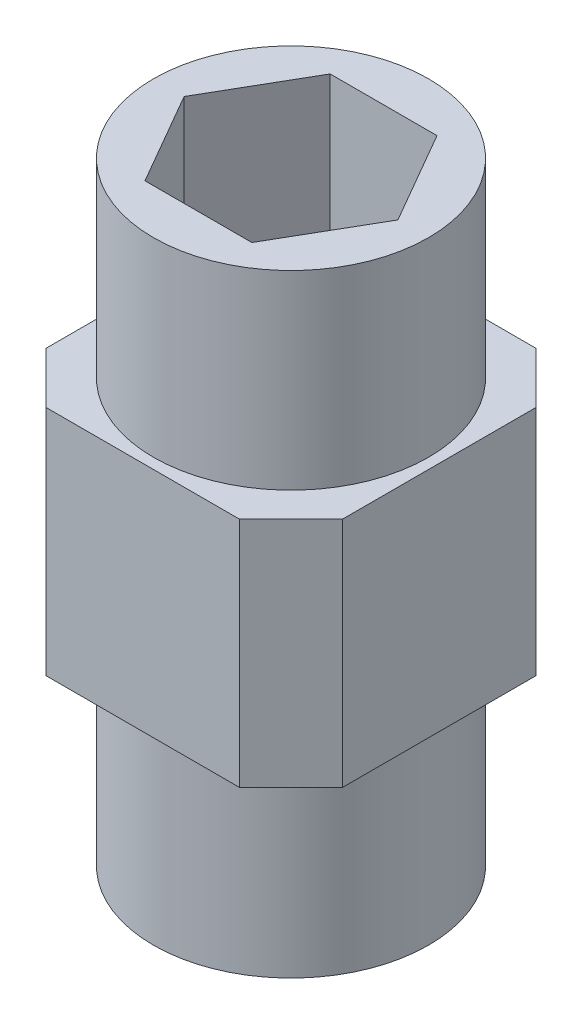
ISO-10303-21;
HEADER;
FILE_DESCRIPTION(('STEP AP214'),'2;1');
FILE_NAME('part.step','',(''),(''),'','','');
FILE_SCHEMA(('AUTOMOTIVE_DESIGN { 1 0 10303 214 1 1 1 1 }'));
ENDSEC;
DATA;
#1=APPLICATION_CONTEXT('core data for automotive mechanical design processes');
#2=APPLICATION_PROTOCOL_DEFINITION('international standard','automotive_design',2000,#1);
#3=PRODUCT_CONTEXT('',#1,'mechanical');
#4=PRODUCT('Part','Part','',(#3));
#5=PRODUCT_RELATED_PRODUCT_CATEGORY('part','',(#4));
#6=PRODUCT_DEFINITION_FORMATION('','',#4);
#7=PRODUCT_DEFINITION_CONTEXT('part definition',#1,'design');
#8=PRODUCT_DEFINITION('design','',#6,#7);
#9=PRODUCT_DEFINITION_SHAPE('','',#8);
#10=(LENGTH_UNIT() NAMED_UNIT(*) SI_UNIT(.MILLI.,.METRE.));
#11=(NAMED_UNIT(*) PLANE_ANGLE_UNIT() SI_UNIT($,.RADIAN.));
#12=(NAMED_UNIT(*) SI_UNIT($,.STERADIAN.) SOLID_ANGLE_UNIT());
#13=UNCERTAINTY_MEASURE_WITH_UNIT(LENGTH_MEASURE(1.E-05),#10,'distance_accuracy_value','');
#14=(GEOMETRIC_REPRESENTATION_CONTEXT(3) GLOBAL_UNCERTAINTY_ASSIGNED_CONTEXT((#13)) GLOBAL_UNIT_ASSIGNED_CONTEXT((#10,
#11,#12)) REPRESENTATION_CONTEXT('',''));
#15=CARTESIAN_POINT('',(0.,0.,0.));
#16=DIRECTION('',(0.,0.,1.));
#17=DIRECTION('',(1.,0.,0.));
#18=AXIS2_PLACEMENT_3D('',#15,#16,#17);
#19=CARTESIAN_POINT('',(0.,13.1,0.));
#20=DIRECTION('',(0.,1.,0.));
#21=DIRECTION('',(0.,0.,1.));
#22=AXIS2_PLACEMENT_3D('',#19,#20,#21);
#23=PLANE('',#22);
#24=CARTESIAN_POINT('',(0.,13.1,0.));
#25=DIRECTION('',(0.,1.,0.));
#26=DIRECTION('',(0.,0.,1.));
#27=AXIS2_PLACEMENT_3D('',#24,#25,#26);
#28=CIRCLE('',#27,9.475);
#29=CARTESIAN_POINT('',(0.,13.1,9.475));
#30=VERTEX_POINT('',#29);
#31=EDGE_CURVE('E11',#30,#30,#28,.T.);
#32=ORIENTED_EDGE('',*,*,#31,.T.);
#33=EDGE_LOOP('',(#32));
#34=FACE_BOUND('',#33,.T.);
#35=DIRECTION('',(-0.5,0.,-0.866025403784438));
#36=VECTOR('',#35,1.);
#37=CARTESIAN_POINT('',(7.36121593216773,13.1,0.));
#38=LINE('',#37,#36);
#39=CARTESIAN_POINT('',(7.36121593216773,13.1,0.));
#40=VERTEX_POINT('',#39);
#41=CARTESIAN_POINT('',(3.68060796608386,13.1,-6.375));
#42=VERTEX_POINT('',#41);
#43=EDGE_CURVE('E281',#40,#42,#38,.T.);
#44=ORIENTED_EDGE('',*,*,#43,.F.);
#45=DIRECTION('',(0.5,0.,-0.866025403784438));
#46=VECTOR('',#45,1.);
#47=CARTESIAN_POINT('',(3.68060796608386,13.1,6.375));
#48=LINE('',#47,#46);
#49=CARTESIAN_POINT('',(3.68060796608386,13.1,6.375));
#50=VERTEX_POINT('',#49);
#51=EDGE_CURVE('E276',#50,#40,#48,.T.);
#52=ORIENTED_EDGE('',*,*,#51,.F.);
#53=DIRECTION('',(1.,0.,0.));
#54=VECTOR('',#53,1.);
#55=CARTESIAN_POINT('',(-3.68060796608386,13.1,6.375));
#56=LINE('',#55,#54);
#57=CARTESIAN_POINT('',(-3.68060796608386,13.1,6.375));
#58=VERTEX_POINT('',#57);
#59=EDGE_CURVE('E69',#58,#50,#56,.T.);
#60=ORIENTED_EDGE('',*,*,#59,.F.);
#61=DIRECTION('',(0.5,0.,0.866025403784438));
#62=VECTOR('',#61,1.);
#63=CARTESIAN_POINT('',(-7.36121593216773,13.1,0.));
#64=LINE('',#63,#62);
#65=CARTESIAN_POINT('',(-7.36121593216773,13.1,0.));
#66=VERTEX_POINT('',#65);
#67=EDGE_CURVE('E292',#66,#58,#64,.T.);
#68=ORIENTED_EDGE('',*,*,#67,.F.);
#69=DIRECTION('',(-0.5,0.,0.866025403784439));
#70=VECTOR('',#69,1.);
#71=CARTESIAN_POINT('',(-3.68060796608386,13.1,-6.375));
#72=LINE('',#71,#70);
#73=CARTESIAN_POINT('',(-3.68060796608386,13.1,-6.375));
#74=VERTEX_POINT('',#73);
#75=EDGE_CURVE('E287',#74,#66,#72,.T.);
#76=ORIENTED_EDGE('',*,*,#75,.F.);
#77=DIRECTION('',(-1.,0.,0.));
#78=VECTOR('',#77,1.);
#79=CARTESIAN_POINT('',(3.68060796608386,13.1,-6.375));
#80=LINE('',#79,#78);
#81=EDGE_CURVE('E282',#42,#74,#80,.T.);
#82=ORIENTED_EDGE('',*,*,#81,.F.);
#83=EDGE_LOOP('',(#44,#52,#60,#68,#76,#82));
#84=FACE_BOUND('',#83,.T.);
#85=ADVANCED_FACE('F44',(#34,#84),#23,.T.);
#86=CARTESIAN_POINT('',(0.,13.1,0.));
#87=DIRECTION('',(0.,-1.,0.));
#88=DIRECTION('',(0.,0.,-1.));
#89=AXIS2_PLACEMENT_3D('',#86,#87,#88);
#90=CYLINDRICAL_SURFACE('',#89,9.475);
#91=ORIENTED_EDGE('',*,*,#31,.F.);
#92=EDGE_LOOP('',(#91));
#93=FACE_BOUND('',#92,.T.);
#94=CARTESIAN_POINT('',(0.,0.,0.));
#95=DIRECTION('',(0.,1.,0.));
#96=DIRECTION('',(0.,0.,1.));
#97=AXIS2_PLACEMENT_3D('',#94,#95,#96);
#98=CIRCLE('',#97,9.475);
#99=CARTESIAN_POINT('',(0.,0.,9.475));
#100=VERTEX_POINT('',#99);
#101=EDGE_CURVE('E47',#100,#100,#98,.T.);
#102=ORIENTED_EDGE('',*,*,#101,.T.);
#103=EDGE_LOOP('',(#102));
#104=FACE_BOUND('',#103,.T.);
#105=ADVANCED_FACE('F50',(#93,#104),#90,.T.);
#106=CARTESIAN_POINT('',(3.68060796608386,13.1,6.375));
#107=DIRECTION('',(-0.866025403784438,0.,-0.5));
#108=DIRECTION('',(-0.5,0.,0.866025403784439));
#109=AXIS2_PLACEMENT_3D('',#106,#107,#108);
#110=PLANE('',#109);
#111=DIRECTION('',(0.,-1.,0.));
#112=VECTOR('',#111,1.);
#113=CARTESIAN_POINT('',(7.36121593216773,13.1,0.));
#114=LINE('',#113,#112);
#115=CARTESIAN_POINT('',(7.36121593216773,-29.1,0.));
#116=VERTEX_POINT('',#115);
#117=EDGE_CURVE('E54',#40,#116,#114,.T.);
#118=ORIENTED_EDGE('',*,*,#117,.T.);
#119=DIRECTION('',(0.5,0.,-0.866025403784438));
#120=VECTOR('',#119,1.);
#121=CARTESIAN_POINT('',(3.68060796608386,-29.1,6.375));
#122=LINE('',#121,#120);
#123=CARTESIAN_POINT('',(3.68060796608386,-29.1,6.375));
#124=VERTEX_POINT('',#123);
#125=EDGE_CURVE('E154',#124,#116,#122,.T.);
#126=ORIENTED_EDGE('',*,*,#125,.F.);
#127=DIRECTION('',(0.,-1.,0.));
#128=VECTOR('',#127,1.);
#129=CARTESIAN_POINT('',(3.68060796608386,13.1,6.375));
#130=LINE('',#129,#128);
#131=EDGE_CURVE('E145',#50,#124,#130,.T.);
#132=ORIENTED_EDGE('',*,*,#131,.F.);
#133=ORIENTED_EDGE('',*,*,#51,.T.);
#134=EDGE_LOOP('',(#118,#126,#132,#133));
#135=FACE_BOUND('',#134,.T.);
#136=ADVANCED_FACE('F156',(#135),#110,.T.);
#137=CARTESIAN_POINT('',(7.36121593216773,13.1,0.));
#138=DIRECTION('',(-0.866025403784438,0.,0.5));
#139=DIRECTION('',(0.5,0.,0.866025403784438));
#140=AXIS2_PLACEMENT_3D('',#137,#138,#139);
#141=PLANE('',#140);
#142=DIRECTION('',(0.,-1.,0.));
#143=VECTOR('',#142,1.);
#144=CARTESIAN_POINT('',(3.68060796608386,13.1,-6.375));
#145=LINE('',#144,#143);
#146=CARTESIAN_POINT('',(3.68060796608386,-29.1,-6.375));
#147=VERTEX_POINT('',#146);
#148=EDGE_CURVE('E305',#42,#147,#145,.T.);
#149=ORIENTED_EDGE('',*,*,#148,.T.);
#150=DIRECTION('',(-0.5,0.,-0.866025403784438));
#151=VECTOR('',#150,1.);
#152=CARTESIAN_POINT('',(7.36121593216773,-29.1,0.));
#153=LINE('',#152,#151);
#154=EDGE_CURVE('E176',#116,#147,#153,.T.);
#155=ORIENTED_EDGE('',*,*,#154,.F.);
#156=ORIENTED_EDGE('',*,*,#117,.F.);
#157=ORIENTED_EDGE('',*,*,#43,.T.);
#158=EDGE_LOOP('',(#149,#155,#156,#157));
#159=FACE_BOUND('',#158,.T.);
#160=ADVANCED_FACE('F367',(#159),#141,.T.);
#161=CARTESIAN_POINT('',(3.68060796608386,13.1,-6.375));
#162=DIRECTION('',(0.,0.,1.));
#163=DIRECTION('',(1.,0.,0.));
#164=AXIS2_PLACEMENT_3D('',#161,#162,#163);
#165=PLANE('',#164);
#166=DIRECTION('',(0.,-1.,0.));
#167=VECTOR('',#166,1.);
#168=CARTESIAN_POINT('',(-3.68060796608386,13.1,-6.375));
#169=LINE('',#168,#167);
#170=CARTESIAN_POINT('',(-3.68060796608386,-29.1,-6.375));
#171=VERTEX_POINT('',#170);
#172=EDGE_CURVE('E303',#74,#171,#169,.T.);
#173=ORIENTED_EDGE('',*,*,#172,.T.);
#174=DIRECTION('',(-1.,0.,0.));
#175=VECTOR('',#174,1.);
#176=CARTESIAN_POINT('',(3.68060796608386,-29.1,-6.375));
#177=LINE('',#176,#175);
#178=EDGE_CURVE('E178',#147,#171,#177,.T.);
#179=ORIENTED_EDGE('',*,*,#178,.F.);
#180=ORIENTED_EDGE('',*,*,#148,.F.);
#181=ORIENTED_EDGE('',*,*,#81,.T.);
#182=EDGE_LOOP('',(#173,#179,#180,#181));
#183=FACE_BOUND('',#182,.T.);
#184=ADVANCED_FACE('F373',(#183),#165,.T.);
#185=CARTESIAN_POINT('',(-3.68060796608386,13.1,-6.375));
#186=DIRECTION('',(0.866025403784439,0.,0.5));
#187=DIRECTION('',(0.5,0.,-0.866025403784439));
#188=AXIS2_PLACEMENT_3D('',#185,#186,#187);
#189=PLANE('',#188);
#190=DIRECTION('',(0.,-1.,0.));
#191=VECTOR('',#190,1.);
#192=CARTESIAN_POINT('',(-7.36121593216773,13.1,0.));
#193=LINE('',#192,#191);
#194=CARTESIAN_POINT('',(-7.36121593216773,-29.1,0.));
#195=VERTEX_POINT('',#194);
#196=EDGE_CURVE('E300',#66,#195,#193,.T.);
#197=ORIENTED_EDGE('',*,*,#196,.T.);
#198=DIRECTION('',(-0.5,0.,0.866025403784439));
#199=VECTOR('',#198,1.);
#200=CARTESIAN_POINT('',(-3.68060796608386,-29.1,-6.375));
#201=LINE('',#200,#199);
#202=EDGE_CURVE('E174',#171,#195,#201,.T.);
#203=ORIENTED_EDGE('',*,*,#202,.F.);
#204=ORIENTED_EDGE('',*,*,#172,.F.);
#205=ORIENTED_EDGE('',*,*,#75,.T.);
#206=EDGE_LOOP('',(#197,#203,#204,#205));
#207=FACE_BOUND('',#206,.T.);
#208=ADVANCED_FACE('F380',(#207),#189,.T.);
#209=CARTESIAN_POINT('',(-7.36121593216773,13.1,0.));
#210=DIRECTION('',(0.866025403784438,0.,-0.5));
#211=DIRECTION('',(-0.5,0.,-0.866025403784439));
#212=AXIS2_PLACEMENT_3D('',#209,#210,#211);
#213=PLANE('',#212);
#214=DIRECTION('',(0.,-1.,0.));
#215=VECTOR('',#214,1.);
#216=CARTESIAN_POINT('',(-3.68060796608386,13.1,6.375));
#217=LINE('',#216,#215);
#218=CARTESIAN_POINT('',(-3.68060796608386,-29.1,6.375));
#219=VERTEX_POINT('',#218);
#220=EDGE_CURVE('E61',#58,#219,#217,.T.);
#221=ORIENTED_EDGE('',*,*,#220,.T.);
#222=DIRECTION('',(0.5,0.,0.866025403784438));
#223=VECTOR('',#222,1.);
#224=CARTESIAN_POINT('',(-7.36121593216773,-29.1,0.));
#225=LINE('',#224,#223);
#226=EDGE_CURVE('E170',#195,#219,#225,.T.);
#227=ORIENTED_EDGE('',*,*,#226,.F.);
#228=ORIENTED_EDGE('',*,*,#196,.F.);
#229=ORIENTED_EDGE('',*,*,#67,.T.);
#230=EDGE_LOOP('',(#221,#227,#228,#229));
#231=FACE_BOUND('',#230,.T.);
#232=ADVANCED_FACE('F381',(#231),#213,.T.);
#233=CARTESIAN_POINT('',(-3.68060796608386,13.1,6.375));
#234=DIRECTION('',(0.,0.,-1.));
#235=DIRECTION('',(-1.,0.,0.));
#236=AXIS2_PLACEMENT_3D('',#233,#234,#235);
#237=PLANE('',#236);
#238=ORIENTED_EDGE('',*,*,#131,.T.);
#239=DIRECTION('',(1.,0.,0.));
#240=VECTOR('',#239,1.);
#241=CARTESIAN_POINT('',(-3.68060796608386,-29.1,6.375));
#242=LINE('',#241,#240);
#243=EDGE_CURVE('E146',#219,#124,#242,.T.);
#244=ORIENTED_EDGE('',*,*,#243,.F.);
#245=ORIENTED_EDGE('',*,*,#220,.F.);
#246=ORIENTED_EDGE('',*,*,#59,.T.);
#247=EDGE_LOOP('',(#238,#244,#245,#246));
#248=FACE_BOUND('',#247,.T.);
#249=ADVANCED_FACE('F148',(#248),#237,.T.);
#250=CARTESIAN_POINT('',(-10.2,-16.,6.66446609406726));
#251=DIRECTION('',(-1.,0.,0.));
#252=DIRECTION('',(0.,0.,1.));
#253=AXIS2_PLACEMENT_3D('',#250,#251,#252);
#254=PLANE('',#253);
#255=DIRECTION('',(0.,0.,1.));
#256=VECTOR('',#255,1.);
#257=CARTESIAN_POINT('',(-10.2,0.,6.66446609406726));
#258=LINE('',#257,#256);
#259=CARTESIAN_POINT('',(-10.2,0.,-6.66446609406726));
#260=VERTEX_POINT('',#259);
#261=CARTESIAN_POINT('',(-10.2,0.,6.66446609406726));
#262=VERTEX_POINT('',#261);
#263=EDGE_CURVE('E190',#260,#262,#258,.T.);
#264=ORIENTED_EDGE('',*,*,#263,.F.);
#265=DIRECTION('',(0.,1.,0.));
#266=VECTOR('',#265,1.);
#267=CARTESIAN_POINT('',(-10.2,-16.,-6.66446609406726));
#268=LINE('',#267,#266);
#269=CARTESIAN_POINT('',(-10.2,-16.,-6.66446609406726));
#270=VERTEX_POINT('',#269);
#271=EDGE_CURVE('E258',#270,#260,#268,.T.);
#272=ORIENTED_EDGE('',*,*,#271,.F.);
#273=DIRECTION('',(0.,0.,1.));
#274=VECTOR('',#273,1.);
#275=CARTESIAN_POINT('',(-10.2,-16.,6.66446609406726));
#276=LINE('',#275,#274);
#277=CARTESIAN_POINT('',(-10.2,-16.,6.66446609406726));
#278=VERTEX_POINT('',#277);
#279=EDGE_CURVE('E194',#270,#278,#276,.T.);
#280=ORIENTED_EDGE('',*,*,#279,.T.);
#281=DIRECTION('',(0.,1.,0.));
#282=VECTOR('',#281,1.);
#283=CARTESIAN_POINT('',(-10.2,-16.,6.66446609406726));
#284=LINE('',#283,#282);
#285=EDGE_CURVE('E223',#278,#262,#284,.T.);
#286=ORIENTED_EDGE('',*,*,#285,.T.);
#287=EDGE_LOOP('',(#264,#272,#280,#286));
#288=FACE_BOUND('',#287,.T.);
#289=ADVANCED_FACE('F323',(#288),#254,.T.);
#290=CARTESIAN_POINT('',(-10.2,-16.,-6.66446609406726));
#291=DIRECTION('',(-0.707106781186549,0.,-0.707106781186546));
#292=DIRECTION('',(-0.707106781186546,0.,0.707106781186549));
#293=AXIS2_PLACEMENT_3D('',#290,#291,#292);
#294=PLANE('',#293);
#295=DIRECTION('',(-0.707106781186546,0.,0.707106781186549));
#296=VECTOR('',#295,1.);
#297=CARTESIAN_POINT('',(-10.2,0.,-6.66446609406726));
#298=LINE('',#297,#296);
#299=CARTESIAN_POINT('',(-6.66446609406727,0.,-10.2));
#300=VERTEX_POINT('',#299);
#301=EDGE_CURVE('E197',#300,#260,#298,.T.);
#302=ORIENTED_EDGE('',*,*,#301,.F.);
#303=DIRECTION('',(0.,1.,0.));
#304=VECTOR('',#303,1.);
#305=CARTESIAN_POINT('',(-6.66446609406727,-16.,-10.2));
#306=LINE('',#305,#304);
#307=CARTESIAN_POINT('',(-6.66446609406727,-16.,-10.2));
#308=VERTEX_POINT('',#307);
#309=EDGE_CURVE('E259',#308,#300,#306,.T.);
#310=ORIENTED_EDGE('',*,*,#309,.F.);
#311=DIRECTION('',(-0.707106781186546,0.,0.707106781186549));
#312=VECTOR('',#311,1.);
#313=CARTESIAN_POINT('',(-10.2,-16.,-6.66446609406726));
#314=LINE('',#313,#312);
#315=EDGE_CURVE('E222',#308,#270,#314,.T.);
#316=ORIENTED_EDGE('',*,*,#315,.T.);
#317=ORIENTED_EDGE('',*,*,#271,.T.);
#318=EDGE_LOOP('',(#302,#310,#316,#317));
#319=FACE_BOUND('',#318,.T.);
#320=ADVANCED_FACE('F350',(#319),#294,.T.);
#321=CARTESIAN_POINT('',(-6.66446609406727,-16.,-10.2));
#322=DIRECTION('',(0.,0.,-1.));
#323=DIRECTION('',(-1.,0.,0.));
#324=AXIS2_PLACEMENT_3D('',#321,#322,#323);
#325=PLANE('',#324);
#326=DIRECTION('',(-1.,0.,0.));
#327=VECTOR('',#326,1.);
#328=CARTESIAN_POINT('',(-6.66446609406727,0.,-10.2));
#329=LINE('',#328,#327);
#330=CARTESIAN_POINT('',(6.66446609406727,0.,-10.2));
#331=VERTEX_POINT('',#330);
#332=EDGE_CURVE('E250',#331,#300,#329,.T.);
#333=ORIENTED_EDGE('',*,*,#332,.F.);
#334=DIRECTION('',(0.,1.,0.));
#335=VECTOR('',#334,1.);
#336=CARTESIAN_POINT('',(6.66446609406727,-16.,-10.2));
#337=LINE('',#336,#335);
#338=CARTESIAN_POINT('',(6.66446609406727,-16.,-10.2));
#339=VERTEX_POINT('',#338);
#340=EDGE_CURVE('E265',#339,#331,#337,.T.);
#341=ORIENTED_EDGE('',*,*,#340,.F.);
#342=DIRECTION('',(-1.,0.,0.));
#343=VECTOR('',#342,1.);
#344=CARTESIAN_POINT('',(-6.66446609406727,-16.,-10.2));
#345=LINE('',#344,#343);
#346=EDGE_CURVE('E220',#339,#308,#345,.T.);
#347=ORIENTED_EDGE('',*,*,#346,.T.);
#348=ORIENTED_EDGE('',*,*,#309,.T.);
#349=EDGE_LOOP('',(#333,#341,#347,#348));
#350=FACE_BOUND('',#349,.T.);
#351=ADVANCED_FACE('F354',(#350),#325,.T.);
#352=CARTESIAN_POINT('',(10.2,-16.,-6.66446609406724));
#353=DIRECTION('',(0.70710678118655,0.,-0.707106781186545));
#354=DIRECTION('',(-0.707106781186545,0.,-0.70710678118655));
#355=AXIS2_PLACEMENT_3D('',#352,#353,#354);
#356=PLANE('',#355);
#357=DIRECTION('',(-0.707106781186545,0.,-0.70710678118655));
#358=VECTOR('',#357,1.);
#359=CARTESIAN_POINT('',(10.2,0.,-6.66446609406724));
#360=LINE('',#359,#358);
#361=CARTESIAN_POINT('',(10.2,0.,-6.66446609406724));
#362=VERTEX_POINT('',#361);
#363=EDGE_CURVE('E242',#362,#331,#360,.T.);
#364=ORIENTED_EDGE('',*,*,#363,.F.);
#365=DIRECTION('',(0.,1.,0.));
#366=VECTOR('',#365,1.);
#367=CARTESIAN_POINT('',(10.2,-16.,-6.66446609406724));
#368=LINE('',#367,#366);
#369=CARTESIAN_POINT('',(10.2,-16.,-6.66446609406724));
#370=VERTEX_POINT('',#369);
#371=EDGE_CURVE('E264',#370,#362,#368,.T.);
#372=ORIENTED_EDGE('',*,*,#371,.F.);
#373=DIRECTION('',(-0.707106781186545,0.,-0.70710678118655));
#374=VECTOR('',#373,1.);
#375=CARTESIAN_POINT('',(10.2,-16.,-6.66446609406724));
#376=LINE('',#375,#374);
#377=EDGE_CURVE('E213',#370,#339,#376,.T.);
#378=ORIENTED_EDGE('',*,*,#377,.T.);
#379=ORIENTED_EDGE('',*,*,#340,.T.);
#380=EDGE_LOOP('',(#364,#372,#378,#379));
#381=FACE_BOUND('',#380,.T.);
#382=ADVANCED_FACE('F342',(#381),#356,.T.);
#383=CARTESIAN_POINT('',(10.2,-16.,6.66446609406724));
#384=DIRECTION('',(1.,0.,0.));
#385=DIRECTION('',(0.,0.,-1.));
#386=AXIS2_PLACEMENT_3D('',#383,#384,#385);
#387=PLANE('',#386);
#388=DIRECTION('',(0.,0.,-1.));
#389=VECTOR('',#388,1.);
#390=CARTESIAN_POINT('',(10.2,0.,6.66446609406724));
#391=LINE('',#390,#389);
#392=CARTESIAN_POINT('',(10.2,0.,6.66446609406724));
#393=VERTEX_POINT('',#392);
#394=EDGE_CURVE('E244',#393,#362,#391,.T.);
#395=ORIENTED_EDGE('',*,*,#394,.F.);
#396=DIRECTION('',(0.,1.,0.));
#397=VECTOR('',#396,1.);
#398=CARTESIAN_POINT('',(10.2,-16.,6.66446609406724));
#399=LINE('',#398,#397);
#400=CARTESIAN_POINT('',(10.2,-16.,6.66446609406724));
#401=VERTEX_POINT('',#400);
#402=EDGE_CURVE('E268',#401,#393,#399,.T.);
#403=ORIENTED_EDGE('',*,*,#402,.F.);
#404=DIRECTION('',(0.,0.,-1.));
#405=VECTOR('',#404,1.);
#406=CARTESIAN_POINT('',(10.2,-16.,6.66446609406724));
#407=LINE('',#406,#405);
#408=EDGE_CURVE('E207',#401,#370,#407,.T.);
#409=ORIENTED_EDGE('',*,*,#408,.T.);
#410=ORIENTED_EDGE('',*,*,#371,.T.);
#411=EDGE_LOOP('',(#395,#403,#409,#410));
#412=FACE_BOUND('',#411,.T.);
#413=ADVANCED_FACE('F338',(#412),#387,.T.);
#414=CARTESIAN_POINT('',(10.2,-16.,6.66446609406724));
#415=DIRECTION('',(0.70710678118655,0.,0.707106781186545));
#416=DIRECTION('',(0.707106781186545,0.,-0.70710678118655));
#417=AXIS2_PLACEMENT_3D('',#414,#415,#416);
#418=PLANE('',#417);
#419=DIRECTION('',(0.707106781186545,0.,-0.70710678118655));
#420=VECTOR('',#419,1.);
#421=CARTESIAN_POINT('',(10.2,0.,6.66446609406724));
#422=LINE('',#421,#420);
#423=CARTESIAN_POINT('',(6.66446609406727,0.,10.2));
#424=VERTEX_POINT('',#423);
#425=EDGE_CURVE('E240',#424,#393,#422,.T.);
#426=ORIENTED_EDGE('',*,*,#425,.F.);
#427=DIRECTION('',(0.,1.,0.));
#428=VECTOR('',#427,1.);
#429=CARTESIAN_POINT('',(6.66446609406727,-16.,10.2));
#430=LINE('',#429,#428);
#431=CARTESIAN_POINT('',(6.66446609406727,-16.,10.2));
#432=VERTEX_POINT('',#431);
#433=EDGE_CURVE('E271',#432,#424,#430,.T.);
#434=ORIENTED_EDGE('',*,*,#433,.F.);
#435=DIRECTION('',(0.707106781186545,0.,-0.70710678118655));
#436=VECTOR('',#435,1.);
#437=CARTESIAN_POINT('',(10.2,-16.,6.66446609406724));
#438=LINE('',#437,#436);
#439=EDGE_CURVE('E202',#432,#401,#438,.T.);
#440=ORIENTED_EDGE('',*,*,#439,.T.);
#441=ORIENTED_EDGE('',*,*,#402,.T.);
#442=EDGE_LOOP('',(#426,#434,#440,#441));
#443=FACE_BOUND('',#442,.T.);
#444=ADVANCED_FACE('F333',(#443),#418,.T.);
#445=CARTESIAN_POINT('',(-6.66446609406727,-16.,10.2));
#446=DIRECTION('',(0.,0.,1.));
#447=DIRECTION('',(1.,0.,0.));
#448=AXIS2_PLACEMENT_3D('',#445,#446,#447);
#449=PLANE('',#448);
#450=DIRECTION('',(1.,0.,0.));
#451=VECTOR('',#450,1.);
#452=CARTESIAN_POINT('',(-6.66446609406727,0.,10.2));
#453=LINE('',#452,#451);
#454=CARTESIAN_POINT('',(-6.66446609406727,0.,10.2));
#455=VERTEX_POINT('',#454);
#456=EDGE_CURVE('E232',#455,#424,#453,.T.);
#457=ORIENTED_EDGE('',*,*,#456,.F.);
#458=DIRECTION('',(0.,1.,0.));
#459=VECTOR('',#458,1.);
#460=CARTESIAN_POINT('',(-6.66446609406727,-16.,10.2));
#461=LINE('',#460,#459);
#462=CARTESIAN_POINT('',(-6.66446609406727,-16.,10.2));
#463=VERTEX_POINT('',#462);
#464=EDGE_CURVE('E273',#463,#455,#461,.T.);
#465=ORIENTED_EDGE('',*,*,#464,.F.);
#466=DIRECTION('',(1.,0.,0.));
#467=VECTOR('',#466,1.);
#468=CARTESIAN_POINT('',(-6.66446609406727,-16.,10.2));
#469=LINE('',#468,#467);
#470=EDGE_CURVE('E203',#463,#432,#469,.T.);
#471=ORIENTED_EDGE('',*,*,#470,.T.);
#472=ORIENTED_EDGE('',*,*,#433,.T.);
#473=EDGE_LOOP('',(#457,#465,#471,#472));
#474=FACE_BOUND('',#473,.T.);
#475=ADVANCED_FACE('F332',(#474),#449,.T.);
#476=CARTESIAN_POINT('',(-10.2,-16.,6.66446609406726));
#477=DIRECTION('',(-0.707106781186548,0.,0.707106781186547));
#478=DIRECTION('',(0.707106781186547,0.,0.707106781186548));
#479=AXIS2_PLACEMENT_3D('',#476,#477,#478);
#480=PLANE('',#479);
#481=DIRECTION('',(0.707106781186547,0.,0.707106781186548));
#482=VECTOR('',#481,1.);
#483=CARTESIAN_POINT('',(-10.2,0.,6.66446609406726));
#484=LINE('',#483,#482);
#485=EDGE_CURVE('E228',#262,#455,#484,.T.);
#486=ORIENTED_EDGE('',*,*,#485,.F.);
#487=ORIENTED_EDGE('',*,*,#285,.F.);
#488=DIRECTION('',(0.707106781186547,0.,0.707106781186548));
#489=VECTOR('',#488,1.);
#490=CARTESIAN_POINT('',(-10.2,-16.,6.66446609406726));
#491=LINE('',#490,#489);
#492=EDGE_CURVE('E198',#278,#463,#491,.T.);
#493=ORIENTED_EDGE('',*,*,#492,.T.);
#494=ORIENTED_EDGE('',*,*,#464,.T.);
#495=EDGE_LOOP('',(#486,#487,#493,#494));
#496=FACE_BOUND('',#495,.T.);
#497=ADVANCED_FACE('F330',(#496),#480,.T.);
#498=CARTESIAN_POINT('',(0.,-16.,0.));
#499=DIRECTION('',(0.,-1.,0.));
#500=DIRECTION('',(0.,0.,-1.));
#501=AXIS2_PLACEMENT_3D('',#498,#499,#500);
#502=PLANE('',#501);
#503=CARTESIAN_POINT('',(0.,-16.,0.));
#504=DIRECTION('',(0.,1.,0.));
#505=DIRECTION('',(0.,0.,1.));
#506=AXIS2_PLACEMENT_3D('',#503,#504,#505);
#507=CIRCLE('',#506,9.475);
#508=CARTESIAN_POINT('',(0.,-16.,9.475));
#509=VERTEX_POINT('',#508);
#510=EDGE_CURVE('E181',#509,#509,#507,.T.);
#511=ORIENTED_EDGE('',*,*,#510,.T.);
#512=EDGE_LOOP('',(#511));
#513=FACE_BOUND('',#512,.T.);
#514=ORIENTED_EDGE('',*,*,#279,.F.);
#515=ORIENTED_EDGE('',*,*,#315,.F.);
#516=ORIENTED_EDGE('',*,*,#346,.F.);
#517=ORIENTED_EDGE('',*,*,#377,.F.);
#518=ORIENTED_EDGE('',*,*,#408,.F.);
#519=ORIENTED_EDGE('',*,*,#439,.F.);
#520=ORIENTED_EDGE('',*,*,#470,.F.);
#521=ORIENTED_EDGE('',*,*,#492,.F.);
#522=EDGE_LOOP('',(#514,#515,#516,#517,#518,#519,#520,#521));
#523=FACE_BOUND('',#522,.T.);
#524=ADVANCED_FACE('F320',(#513,#523),#502,.T.);
#525=CARTESIAN_POINT('',(0.,0.,0.));
#526=DIRECTION('',(0.,-1.,0.));
#527=DIRECTION('',(0.,0.,-1.));
#528=AXIS2_PLACEMENT_3D('',#525,#526,#527);
#529=PLANE('',#528);
#530=ORIENTED_EDGE('',*,*,#101,.F.);
#531=EDGE_LOOP('',(#530));
#532=FACE_BOUND('',#531,.T.);
#533=ORIENTED_EDGE('',*,*,#263,.T.);
#534=ORIENTED_EDGE('',*,*,#485,.T.);
#535=ORIENTED_EDGE('',*,*,#456,.T.);
#536=ORIENTED_EDGE('',*,*,#425,.T.);
#537=ORIENTED_EDGE('',*,*,#394,.T.);
#538=ORIENTED_EDGE('',*,*,#363,.T.);
#539=ORIENTED_EDGE('',*,*,#332,.T.);
#540=ORIENTED_EDGE('',*,*,#301,.T.);
#541=EDGE_LOOP('',(#533,#534,#535,#536,#537,#538,#539,#540));
#542=FACE_BOUND('',#541,.T.);
#543=ADVANCED_FACE('F311',(#532,#542),#529,.F.);
#544=CARTESIAN_POINT('',(0.,-29.1,0.));
#545=DIRECTION('',(0.,1.,0.));
#546=DIRECTION('',(0.,0.,1.));
#547=AXIS2_PLACEMENT_3D('',#544,#545,#546);
#548=CYLINDRICAL_SURFACE('',#547,9.475);
#549=CARTESIAN_POINT('',(0.,-29.1,0.));
#550=DIRECTION('',(0.,1.,0.));
#551=DIRECTION('',(0.,0.,1.));
#552=AXIS2_PLACEMENT_3D('',#549,#550,#551);
#553=CIRCLE('',#552,9.475);
#554=CARTESIAN_POINT('',(0.,-29.1,9.475));
#555=VERTEX_POINT('',#554);
#556=EDGE_CURVE('E184',#555,#555,#553,.T.);
#557=ORIENTED_EDGE('',*,*,#556,.T.);
#558=EDGE_LOOP('',(#557));
#559=FACE_BOUND('',#558,.T.);
#560=ORIENTED_EDGE('',*,*,#510,.F.);
#561=EDGE_LOOP('',(#560));
#562=FACE_BOUND('',#561,.T.);
#563=ADVANCED_FACE('F316',(#559,#562),#548,.T.);
#564=CARTESIAN_POINT('',(0.,-29.1,0.));
#565=DIRECTION('',(0.,-1.,0.));
#566=DIRECTION('',(0.,0.,1.));
#567=AXIS2_PLACEMENT_3D('',#564,#565,#566);
#568=PLANE('',#567);
#569=ORIENTED_EDGE('',*,*,#125,.T.);
#570=ORIENTED_EDGE('',*,*,#154,.T.);
#571=ORIENTED_EDGE('',*,*,#178,.T.);
#572=ORIENTED_EDGE('',*,*,#202,.T.);
#573=ORIENTED_EDGE('',*,*,#226,.T.);
#574=ORIENTED_EDGE('',*,*,#243,.T.);
#575=EDGE_LOOP('',(#569,#570,#571,#572,#573,#574));
#576=FACE_BOUND('',#575,.T.);
#577=ORIENTED_EDGE('',*,*,#556,.F.);
#578=EDGE_LOOP('',(#577));
#579=FACE_BOUND('',#578,.T.);
#580=ADVANCED_FACE('F162',(#576,#579),#568,.T.);
#581=CLOSED_SHELL('',(#85,#105,#136,#160,#184,#208,#232,#249,#289,#320,#351,#382,#413,#444,#475,
#497,#524,#543,#563,#580));
#582=MANIFOLD_SOLID_BREP('B2',#581);
#583=ADVANCED_BREP_SHAPE_REPRESENTATION('',(#18,#582),#14);
#584=SHAPE_DEFINITION_REPRESENTATION(#9,#583);
ENDSEC;
END-ISO-10303-21;
